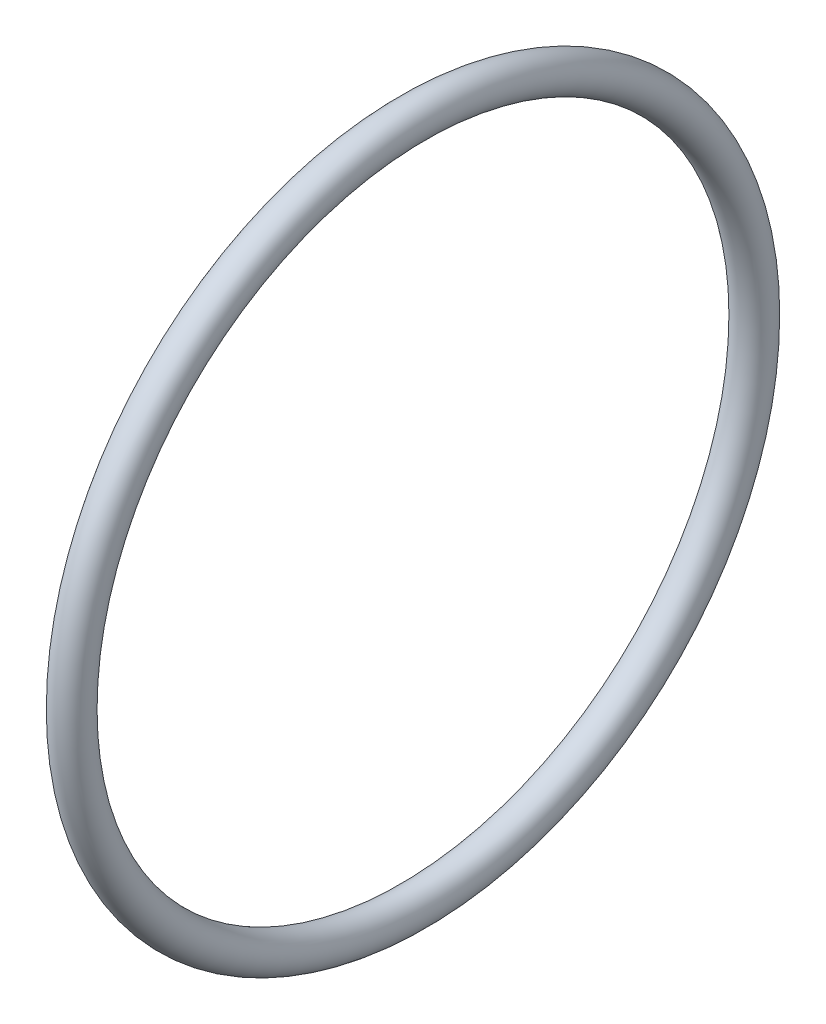
ISO-10303-21;
HEADER;
FILE_DESCRIPTION(('STEP AP214'),'2;1');
FILE_NAME('part.step','',(''),(''),'','','');
FILE_SCHEMA(('AUTOMOTIVE_DESIGN { 1 0 10303 214 1 1 1 1 }'));
ENDSEC;
DATA;
#1=APPLICATION_CONTEXT('core data for automotive mechanical design processes');
#2=APPLICATION_PROTOCOL_DEFINITION('international standard','automotive_design',2000,#1);
#3=PRODUCT_CONTEXT('',#1,'mechanical');
#4=PRODUCT('Part','Part','',(#3));
#5=PRODUCT_RELATED_PRODUCT_CATEGORY('part','',(#4));
#6=PRODUCT_DEFINITION_FORMATION('','',#4);
#7=PRODUCT_DEFINITION_CONTEXT('part definition',#1,'design');
#8=PRODUCT_DEFINITION('design','',#6,#7);
#9=PRODUCT_DEFINITION_SHAPE('','',#8);
#10=(LENGTH_UNIT() NAMED_UNIT(*) SI_UNIT(.MILLI.,.METRE.));
#11=(NAMED_UNIT(*) PLANE_ANGLE_UNIT() SI_UNIT($,.RADIAN.));
#12=(NAMED_UNIT(*) SI_UNIT($,.STERADIAN.) SOLID_ANGLE_UNIT());
#13=UNCERTAINTY_MEASURE_WITH_UNIT(LENGTH_MEASURE(1.E-05),#10,'distance_accuracy_value','');
#14=(GEOMETRIC_REPRESENTATION_CONTEXT(3) GLOBAL_UNCERTAINTY_ASSIGNED_CONTEXT((#13)) GLOBAL_UNIT_ASSIGNED_CONTEXT((#10,
#11,#12)) REPRESENTATION_CONTEXT('',''));
#15=CARTESIAN_POINT('',(0.,0.,0.));
#16=DIRECTION('',(0.,0.,1.));
#17=DIRECTION('',(1.,0.,0.));
#18=AXIS2_PLACEMENT_3D('',#15,#16,#17);
#19=CARTESIAN_POINT('',(0.,-47.5,0.));
#20=DIRECTION('',(-1.,0.,0.));
#21=DIRECTION('',(0.,0.,1.));
#22=AXIS2_PLACEMENT_3D('',#19,#20,#21);
#23=TOROIDAL_SURFACE('',#22,47.5,2.5);
#24=CARTESIAN_POINT('',(0.,-47.5,50.));
#25=VERTEX_POINT('',#24);
#26=VERTEX_LOOP('',#25);
#27=FACE_BOUND('',#26,.T.);
#28=ADVANCED_FACE('F37',(#27),#23,.T.);
#29=CLOSED_SHELL('',(#28));
#30=MANIFOLD_SOLID_BREP('B2',#29);
#31=ADVANCED_BREP_SHAPE_REPRESENTATION('',(#18,#30),#14);
#32=SHAPE_DEFINITION_REPRESENTATION(#9,#31);
ENDSEC;
END-ISO-10303-21;
